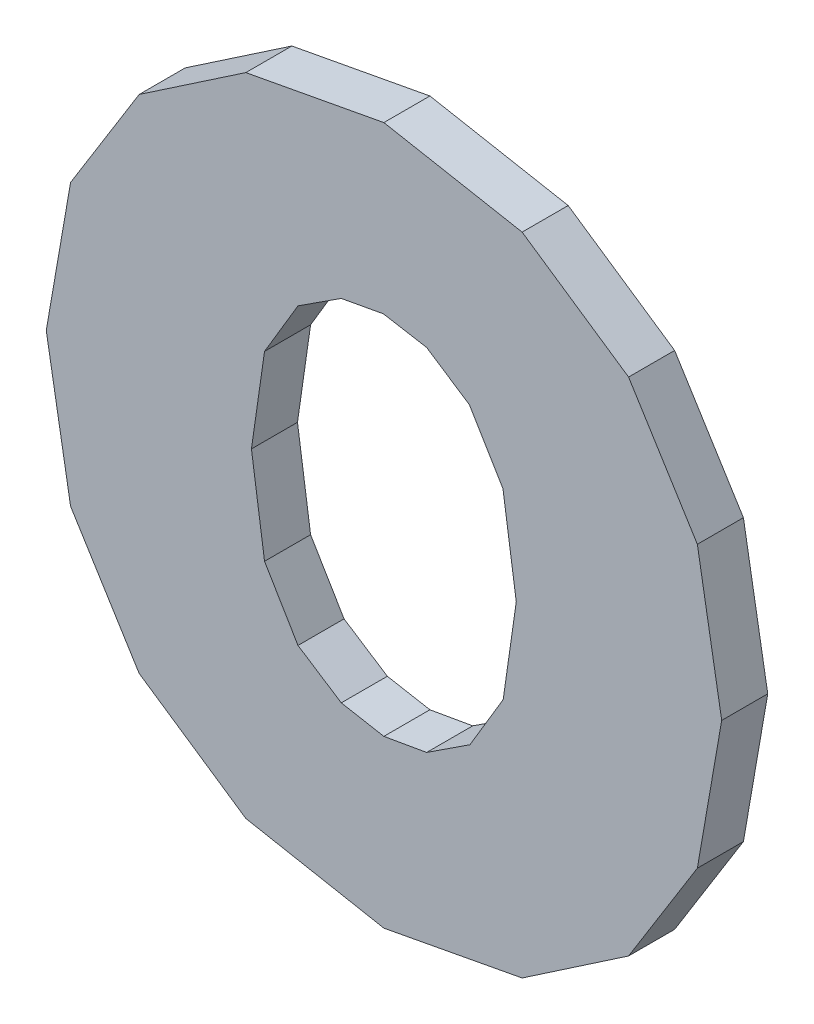
ISO-10303-21;
HEADER;
FILE_DESCRIPTION(('STEP AP214'),'2;1');
FILE_NAME('part.step','',(''),(''),'','','');
FILE_SCHEMA(('AUTOMOTIVE_DESIGN { 1 0 10303 214 1 1 1 1 }'));
ENDSEC;
DATA;
#1=APPLICATION_CONTEXT('core data for automotive mechanical design processes');
#2=APPLICATION_PROTOCOL_DEFINITION('international standard','automotive_design',2000,#1);
#3=PRODUCT_CONTEXT('',#1,'mechanical');
#4=PRODUCT('Part','Part','',(#3));
#5=PRODUCT_RELATED_PRODUCT_CATEGORY('part','',(#4));
#6=PRODUCT_DEFINITION_FORMATION('','',#4);
#7=PRODUCT_DEFINITION_CONTEXT('part definition',#1,'design');
#8=PRODUCT_DEFINITION('design','',#6,#7);
#9=PRODUCT_DEFINITION_SHAPE('','',#8);
#10=(LENGTH_UNIT() NAMED_UNIT(*) SI_UNIT(.MILLI.,.METRE.));
#11=(NAMED_UNIT(*) PLANE_ANGLE_UNIT() SI_UNIT($,.RADIAN.));
#12=(NAMED_UNIT(*) SI_UNIT($,.STERADIAN.) SOLID_ANGLE_UNIT());
#13=UNCERTAINTY_MEASURE_WITH_UNIT(LENGTH_MEASURE(1.E-05),#10,'distance_accuracy_value','');
#14=(GEOMETRIC_REPRESENTATION_CONTEXT(3) GLOBAL_UNCERTAINTY_ASSIGNED_CONTEXT((#13)) GLOBAL_UNIT_ASSIGNED_CONTEXT((#10,
#11,#12)) REPRESENTATION_CONTEXT('',''));
#15=CARTESIAN_POINT('',(0.,0.,0.));
#16=DIRECTION('',(0.,0.,1.));
#17=DIRECTION('',(1.,0.,0.));
#18=AXIS2_PLACEMENT_3D('',#15,#16,#17);
#19=CARTESIAN_POINT('',(0.,0.,0.));
#20=DIRECTION('',(0.,0.,1.));
#21=DIRECTION('',(1.,0.,0.));
#22=AXIS2_PLACEMENT_3D('',#19,#20,#21);
#23=PLANE('',#22);
#24=DIRECTION('',(0.98360655737704,0.180327868852507,0.));
#25=VECTOR('',#24,1.);
#26=CARTESIAN_POINT('',(1.83261,1.206246,0.));
#27=LINE('',#26,#25);
#28=CARTESIAN_POINT('',(1.83261,1.206246,0.));
#29=VERTEX_POINT('',#28);
#30=CARTESIAN_POINT('',(1.87833,1.214628,0.));
#31=VERTEX_POINT('',#30);
#32=EDGE_CURVE('E380',#29,#31,#27,.T.);
#33=ORIENTED_EDGE('',*,*,#32,.F.);
#34=DIRECTION('',(0.838961287027681,0.544191105098988,0.));
#35=VECTOR('',#34,1.);
#36=CARTESIAN_POINT('',(1.78562,1.175766,0.));
#37=LINE('',#36,#35);
#38=CARTESIAN_POINT('',(1.78562,1.175766,0.));
#39=VERTEX_POINT('',#38);
#40=EDGE_CURVE('E375',#39,#29,#37,.T.);
#41=ORIENTED_EDGE('',*,*,#40,.F.);
#42=DIRECTION('',(0.511861383207581,0.859068055732968,0.));
#43=VECTOR('',#42,1.);
#44=CARTESIAN_POINT('',(1.749298,1.114806,0.));
#45=LINE('',#44,#43);
#46=CARTESIAN_POINT('',(1.749298,1.114806,0.));
#47=VERTEX_POINT('',#46);
#48=EDGE_CURVE('E370',#47,#39,#45,.T.);
#49=ORIENTED_EDGE('',*,*,#48,.F.);
#50=DIRECTION('',(0.142489948446306,0.989796249028945,0.));
#51=VECTOR('',#50,1.);
#52=CARTESIAN_POINT('',(1.735074,1.016,0.));
#53=LINE('',#52,#51);
#54=CARTESIAN_POINT('',(1.735074,1.016,0.));
#55=VERTEX_POINT('',#54);
#56=EDGE_CURVE('E365',#55,#47,#53,.T.);
#57=ORIENTED_EDGE('',*,*,#56,.F.);
#58=DIRECTION('',(-0.142849706060598,0.989744391991387,0.));
#59=VECTOR('',#58,1.);
#60=CARTESIAN_POINT('',(1.749298,0.917448,0.));
#61=LINE('',#60,#59);
#62=CARTESIAN_POINT('',(1.749298,0.917448,0.));
#63=VERTEX_POINT('',#62);
#64=EDGE_CURVE('E360',#63,#55,#61,.T.);
#65=ORIENTED_EDGE('',*,*,#64,.F.);
#66=DIRECTION('',(-0.511861383207581,0.859068055732968,0.));
#67=VECTOR('',#66,1.);
#68=CARTESIAN_POINT('',(1.78562,0.856488,0.));
#69=LINE('',#68,#67);
#70=CARTESIAN_POINT('',(1.78562,0.856487999999999,0.));
#71=VERTEX_POINT('',#70);
#72=EDGE_CURVE('E355',#71,#63,#69,.T.);
#73=ORIENTED_EDGE('',*,*,#72,.F.);
#74=DIRECTION('',(-0.838961287027681,0.544191105098988,0.));
#75=VECTOR('',#74,1.);
#76=CARTESIAN_POINT('',(1.83261,0.826008,0.));
#77=LINE('',#76,#75);
#78=CARTESIAN_POINT('',(1.83261,0.826007999999999,0.));
#79=VERTEX_POINT('',#78);
#80=EDGE_CURVE('E350',#79,#71,#77,.T.);
#81=ORIENTED_EDGE('',*,*,#80,.F.);
#82=DIRECTION('',(-0.983956296723587,0.178409658197098,0.));
#83=VECTOR('',#82,1.);
#84=CARTESIAN_POINT('',(1.878838,0.817626,0.));
#85=LINE('',#84,#83);
#86=CARTESIAN_POINT('',(1.878838,0.817626,0.));
#87=VERTEX_POINT('',#86);
#88=EDGE_CURVE('E345',#87,#79,#85,.T.);
#89=ORIENTED_EDGE('',*,*,#88,.F.);
#90=DIRECTION('',(-0.985053308492465,-0.172249758862094,0.));
#91=VECTOR('',#90,1.);
#92=CARTESIAN_POINT('',(1.92532,0.825754,0.));
#93=LINE('',#92,#91);
#94=CARTESIAN_POINT('',(1.92532,0.825754000000001,0.));
#95=VERTEX_POINT('',#94);
#96=EDGE_CURVE('E340',#95,#87,#93,.T.);
#97=ORIENTED_EDGE('',*,*,#96,.F.);
#98=DIRECTION('',(-0.83688991245928,-0.547371240040887,0.));
#99=VECTOR('',#98,1.);
#100=CARTESIAN_POINT('',(1.97231,0.856488,0.));
#101=LINE('',#100,#99);
#102=CARTESIAN_POINT('',(1.97231,0.856488,0.));
#103=VERTEX_POINT('',#102);
#104=EDGE_CURVE('E335',#103,#95,#101,.T.);
#105=ORIENTED_EDGE('',*,*,#104,.F.);
#106=DIRECTION('',(-0.51237167857578,-0.858763799303067,0.));
#107=VECTOR('',#106,1.);
#108=CARTESIAN_POINT('',(2.008378,0.91694,0.));
#109=LINE('',#108,#107);
#110=CARTESIAN_POINT('',(2.008378,0.91694,0.));
#111=VERTEX_POINT('',#110);
#112=EDGE_CURVE('E330',#111,#103,#109,.T.);
#113=ORIENTED_EDGE('',*,*,#112,.F.);
#114=DIRECTION('',(-0.142131979695406,-0.989847715736044,0.));
#115=VECTOR('',#114,1.);
#116=CARTESIAN_POINT('',(2.022602,1.016,0.));
#117=LINE('',#116,#115);
#118=CARTESIAN_POINT('',(2.022602,1.016,0.));
#119=VERTEX_POINT('',#118);
#120=EDGE_CURVE('E325',#119,#111,#117,.T.);
#121=ORIENTED_EDGE('',*,*,#120,.F.);
#122=DIRECTION('',(0.144255265965495,-0.989540508640866,0.));
#123=VECTOR('',#122,1.);
#124=CARTESIAN_POINT('',(2.008124,1.115314,0.));
#125=LINE('',#124,#123);
#126=CARTESIAN_POINT('',(2.008124,1.115314,0.));
#127=VERTEX_POINT('',#126);
#128=EDGE_CURVE('E320',#127,#119,#125,.T.);
#129=ORIENTED_EDGE('',*,*,#128,.F.);
#130=DIRECTION('',(0.515025300745111,-0.857174976065219,0.));
#131=VECTOR('',#130,1.);
#132=CARTESIAN_POINT('',(1.971802,1.175766,0.));
#133=LINE('',#132,#131);
#134=CARTESIAN_POINT('',(1.971802,1.175766,0.));
#135=VERTEX_POINT('',#134);
#136=EDGE_CURVE('E315',#135,#127,#133,.T.);
#137=ORIENTED_EDGE('',*,*,#136,.F.);
#138=DIRECTION('',(0.83414808844179,-0.551540539352193,0.));
#139=VECTOR('',#138,1.);
#140=CARTESIAN_POINT('',(1.92532,1.2065,0.));
#141=LINE('',#140,#139);
#142=CARTESIAN_POINT('',(1.92532,1.2065,0.));
#143=VERTEX_POINT('',#142);
#144=EDGE_CURVE('E391',#143,#135,#141,.T.);
#145=ORIENTED_EDGE('',*,*,#144,.F.);
#146=DIRECTION('',(0.98536771333505,-0.170441982847109,0.));
#147=VECTOR('',#146,1.);
#148=CARTESIAN_POINT('',(1.87833,1.214628,0.));
#149=LINE('',#148,#147);
#150=EDGE_CURVE('E385',#31,#143,#149,.T.);
#151=ORIENTED_EDGE('',*,*,#150,.F.);
#152=EDGE_LOOP('',(#33,#41,#49,#57,#65,#73,#81,#89,#97,#105,#113,#121,#129,#137,#145,#151));
#153=FACE_BOUND('',#152,.T.);
#154=DIRECTION('',(-0.827264523037134,0.561812610150523,0.));
#155=VECTOR('',#154,1.);
#156=CARTESIAN_POINT('',(2.144522,1.288288,0.));
#157=LINE('',#156,#155);
#158=CARTESIAN_POINT('',(2.144522,1.288288,0.));
#159=VERTEX_POINT('',#158);
#160=CARTESIAN_POINT('',(2.028952,1.366774,0.));
#161=VERTEX_POINT('',#160);
#162=EDGE_CURVE('E302',#159,#161,#157,.T.);
#163=ORIENTED_EDGE('',*,*,#162,.F.);
#164=DIRECTION('',(-0.528705152075006,0.84880555027011,0.));
#165=VECTOR('',#164,1.);
#166=CARTESIAN_POINT('',(2.219198,1.1684,0.));
#167=LINE('',#166,#165);
#168=CARTESIAN_POINT('',(2.219198,1.1684,0.));
#169=VERTEX_POINT('',#168);
#170=EDGE_CURVE('E297',#169,#159,#167,.T.);
#171=ORIENTED_EDGE('',*,*,#170,.F.);
#172=DIRECTION('',(-0.170786723535908,0.985308020399646,0.));
#173=VECTOR('',#172,1.);
#174=CARTESIAN_POINT('',(2.245614,1.016,0.));
#175=LINE('',#174,#173);
#176=CARTESIAN_POINT('',(2.245614,1.016,0.));
#177=VERTEX_POINT('',#176);
#178=EDGE_CURVE('E292',#177,#169,#175,.T.);
#179=ORIENTED_EDGE('',*,*,#178,.F.);
#180=DIRECTION('',(0.171063506644398,0.98526000461529,0.));
#181=VECTOR('',#180,1.);
#182=CARTESIAN_POINT('',(2.219198,0.863854,0.));
#183=LINE('',#182,#181);
#184=CARTESIAN_POINT('',(2.219198,0.863854000000001,0.));
#185=VERTEX_POINT('',#184);
#186=EDGE_CURVE('E287',#185,#177,#183,.T.);
#187=ORIENTED_EDGE('',*,*,#186,.F.);
#188=DIRECTION('',(0.528705152075006,0.84880555027011,0.));
#189=VECTOR('',#188,1.);
#190=CARTESIAN_POINT('',(2.144522,0.743966,0.));
#191=LINE('',#190,#189);
#192=CARTESIAN_POINT('',(2.144522,0.743966000000001,0.));
#193=VERTEX_POINT('',#192);
#194=EDGE_CURVE('E282',#193,#185,#191,.T.);
#195=ORIENTED_EDGE('',*,*,#194,.F.);
#196=DIRECTION('',(0.827264523037134,0.561812610150523,0.));
#197=VECTOR('',#196,1.);
#198=CARTESIAN_POINT('',(2.028952,0.66548,0.));
#199=LINE('',#198,#197);
#200=CARTESIAN_POINT('',(2.028952,0.665480000000001,0.));
#201=VERTEX_POINT('',#200);
#202=EDGE_CURVE('E277',#201,#193,#199,.T.);
#203=ORIENTED_EDGE('',*,*,#202,.F.);
#204=DIRECTION('',(0.982815662528847,0.184589743723709,0.));
#205=VECTOR('',#204,1.);
#206=CARTESIAN_POINT('',(1.878838,0.637286,0.));
#207=LINE('',#206,#205);
#208=CARTESIAN_POINT('',(1.878838,0.637285999999999,0.));
#209=VERTEX_POINT('',#208);
#210=EDGE_CURVE('E272',#209,#201,#207,.T.);
#211=ORIENTED_EDGE('',*,*,#210,.F.);
#212=DIRECTION('',(0.982758860293134,-0.184891921173806,0.));
#213=VECTOR('',#212,1.);
#214=CARTESIAN_POINT('',(1.728978,0.66548,0.));
#215=LINE('',#214,#213);
#216=CARTESIAN_POINT('',(1.728978,0.665479999999999,0.));
#217=VERTEX_POINT('',#216);
#218=EDGE_CURVE('E267',#217,#209,#215,.T.);
#219=ORIENTED_EDGE('',*,*,#218,.F.);
#220=DIRECTION('',(0.827837103819016,-0.560968563772111,0.));
#221=VECTOR('',#220,1.);
#222=CARTESIAN_POINT('',(1.613154,0.743966,0.));
#223=LINE('',#222,#221);
#224=CARTESIAN_POINT('',(1.613154,0.743966000000002,0.));
#225=VERTEX_POINT('',#224);
#226=EDGE_CURVE('E262',#225,#217,#223,.T.);
#227=ORIENTED_EDGE('',*,*,#226,.F.);
#228=DIRECTION('',(0.5274076685633,-0.8496123534534,0.));
#229=VECTOR('',#228,1.);
#230=CARTESIAN_POINT('',(1.538732,0.863854,0.));
#231=LINE('',#230,#229);
#232=CARTESIAN_POINT('',(1.538732,0.863854,0.));
#233=VERTEX_POINT('',#232);
#234=EDGE_CURVE('E257',#233,#225,#231,.T.);
#235=ORIENTED_EDGE('',*,*,#234,.F.);
#236=DIRECTION('',(0.171063506644398,-0.98526000461529,0.));
#237=VECTOR('',#236,1.);
#238=CARTESIAN_POINT('',(1.512316,1.016,0.));
#239=LINE('',#238,#237);
#240=CARTESIAN_POINT('',(1.512316,1.016,0.));
#241=VERTEX_POINT('',#240);
#242=EDGE_CURVE('E252',#241,#233,#239,.T.);
#243=ORIENTED_EDGE('',*,*,#242,.F.);
#244=DIRECTION('',(-0.170786723535908,-0.985308020399646,0.));
#245=VECTOR('',#244,1.);
#246=CARTESIAN_POINT('',(1.538732,1.1684,0.));
#247=LINE('',#246,#245);
#248=CARTESIAN_POINT('',(1.538732,1.1684,0.));
#249=VERTEX_POINT('',#248);
#250=EDGE_CURVE('E238',#249,#241,#247,.T.);
#251=ORIENTED_EDGE('',*,*,#250,.F.);
#252=DIRECTION('',(-0.5274076685633,-0.8496123534534,0.));
#253=VECTOR('',#252,1.);
#254=CARTESIAN_POINT('',(1.613154,1.288288,0.));
#255=LINE('',#254,#253);
#256=CARTESIAN_POINT('',(1.613154,1.288288,0.));
#257=VERTEX_POINT('',#256);
#258=EDGE_CURVE('E223',#257,#249,#255,.T.);
#259=ORIENTED_EDGE('',*,*,#258,.F.);
#260=DIRECTION('',(-0.827837103819016,-0.560968563772111,0.));
#261=VECTOR('',#260,1.);
#262=CARTESIAN_POINT('',(1.728978,1.366774,0.));
#263=LINE('',#262,#261);
#264=CARTESIAN_POINT('',(1.728978,1.366774,0.));
#265=VERTEX_POINT('',#264);
#266=EDGE_CURVE('E20',#265,#257,#263,.T.);
#267=ORIENTED_EDGE('',*,*,#266,.F.);
#268=DIRECTION('',(-0.983060298944251,-0.18328242861671,0.));
#269=VECTOR('',#268,1.);
#270=CARTESIAN_POINT('',(1.878838,1.394714,0.));
#271=LINE('',#270,#269);
#272=CARTESIAN_POINT('',(1.878838,1.394714,0.));
#273=VERTEX_POINT('',#272);
#274=EDGE_CURVE('E313',#273,#265,#271,.T.);
#275=ORIENTED_EDGE('',*,*,#274,.F.);
#276=DIRECTION('',(-0.983116133589082,0.182982698299197,0.));
#277=VECTOR('',#276,1.);
#278=CARTESIAN_POINT('',(2.028952,1.366774,0.));
#279=LINE('',#278,#277);
#280=EDGE_CURVE('E307',#161,#273,#279,.T.);
#281=ORIENTED_EDGE('',*,*,#280,.F.);
#282=EDGE_LOOP('',(#163,#171,#179,#187,#195,#203,#211,#219,#227,#235,#243,#251,#259,#267,#275,#281));
#283=FACE_BOUND('',#282,.T.);
#284=ADVANCED_FACE('F17',(#153,#283),#23,.F.);
#285=CARTESIAN_POINT('',(1.728978,1.366774,0.));
#286=DIRECTION('',(-0.560968563772111,0.827837103819016,0.));
#287=DIRECTION('',(-0.827837103819016,-0.560968563772111,0.));
#288=AXIS2_PLACEMENT_3D('',#285,#286,#287);
#289=PLANE('',#288);
#290=DIRECTION('',(0.,0.,1.));
#291=VECTOR('',#290,1.);
#292=CARTESIAN_POINT('',(1.728978,1.366774,0.));
#293=LINE('',#292,#291);
#294=CARTESIAN_POINT('',(1.728978,1.366774,0.05));
#295=VERTEX_POINT('',#294);
#296=EDGE_CURVE('E232',#265,#295,#293,.T.);
#297=ORIENTED_EDGE('',*,*,#296,.F.);
#298=ORIENTED_EDGE('',*,*,#266,.T.);
#299=DIRECTION('',(0.,0.,1.));
#300=VECTOR('',#299,1.);
#301=CARTESIAN_POINT('',(1.613154,1.288288,0.));
#302=LINE('',#301,#300);
#303=CARTESIAN_POINT('',(1.613154,1.288288,0.05));
#304=VERTEX_POINT('',#303);
#305=EDGE_CURVE('E229',#304,#257,#302,.F.);
#306=ORIENTED_EDGE('',*,*,#305,.F.);
#307=DIRECTION('',(-0.827837103819023,-0.5609685637721,0.));
#308=VECTOR('',#307,1.);
#309=CARTESIAN_POINT('',(1.728978,1.366774,0.05));
#310=LINE('',#309,#308);
#311=EDGE_CURVE('E394',#295,#304,#310,.T.);
#312=ORIENTED_EDGE('',*,*,#311,.F.);
#313=EDGE_LOOP('',(#297,#298,#306,#312));
#314=FACE_BOUND('',#313,.T.);
#315=ADVANCED_FACE('F228',(#314),#289,.T.);
#316=CARTESIAN_POINT('',(1.613154,1.288288,0.));
#317=DIRECTION('',(-0.8496123534534,0.5274076685633,0.));
#318=DIRECTION('',(-0.5274076685633,-0.8496123534534,0.));
#319=AXIS2_PLACEMENT_3D('',#316,#317,#318);
#320=PLANE('',#319);
#321=ORIENTED_EDGE('',*,*,#305,.T.);
#322=ORIENTED_EDGE('',*,*,#258,.T.);
#323=DIRECTION('',(0.,0.,1.));
#324=VECTOR('',#323,1.);
#325=CARTESIAN_POINT('',(1.538732,1.1684,0.));
#326=LINE('',#325,#324);
#327=CARTESIAN_POINT('',(1.538732,1.1684,0.05));
#328=VERTEX_POINT('',#327);
#329=EDGE_CURVE('E240',#328,#249,#326,.F.);
#330=ORIENTED_EDGE('',*,*,#329,.F.);
#331=DIRECTION('',(-0.527407668563252,-0.849612353453429,0.));
#332=VECTOR('',#331,1.);
#333=CARTESIAN_POINT('',(1.613154,1.288288,0.05));
#334=LINE('',#333,#332);
#335=EDGE_CURVE('E244',#304,#328,#334,.T.);
#336=ORIENTED_EDGE('',*,*,#335,.F.);
#337=EDGE_LOOP('',(#321,#322,#330,#336));
#338=FACE_BOUND('',#337,.T.);
#339=ADVANCED_FACE('F242',(#338),#320,.T.);
#340=CARTESIAN_POINT('',(1.538732,1.1684,0.));
#341=DIRECTION('',(-0.985308020399646,0.170786723535908,0.));
#342=DIRECTION('',(-0.170786723535908,-0.985308020399646,0.));
#343=AXIS2_PLACEMENT_3D('',#340,#341,#342);
#344=PLANE('',#343);
#345=ORIENTED_EDGE('',*,*,#329,.T.);
#346=ORIENTED_EDGE('',*,*,#250,.T.);
#347=DIRECTION('',(0.,0.,1.));
#348=VECTOR('',#347,1.);
#349=CARTESIAN_POINT('',(1.512316,1.016,0.));
#350=LINE('',#349,#348);
#351=CARTESIAN_POINT('',(1.512316,1.016,0.05));
#352=VERTEX_POINT('',#351);
#353=EDGE_CURVE('E249',#352,#241,#350,.F.);
#354=ORIENTED_EDGE('',*,*,#353,.F.);
#355=DIRECTION('',(-0.170786723535938,-0.985308020399641,0.));
#356=VECTOR('',#355,1.);
#357=CARTESIAN_POINT('',(1.538732,1.1684,0.05));
#358=LINE('',#357,#356);
#359=EDGE_CURVE('E397',#328,#352,#358,.T.);
#360=ORIENTED_EDGE('',*,*,#359,.F.);
#361=EDGE_LOOP('',(#345,#346,#354,#360));
#362=FACE_BOUND('',#361,.T.);
#363=ADVANCED_FACE('F793',(#362),#344,.T.);
#364=CARTESIAN_POINT('',(1.512316,1.016,0.));
#365=DIRECTION('',(-0.98526000461529,-0.171063506644398,0.));
#366=DIRECTION('',(0.171063506644398,-0.98526000461529,0.));
#367=AXIS2_PLACEMENT_3D('',#364,#365,#366);
#368=PLANE('',#367);
#369=ORIENTED_EDGE('',*,*,#353,.T.);
#370=ORIENTED_EDGE('',*,*,#242,.T.);
#371=DIRECTION('',(0.,0.,1.));
#372=VECTOR('',#371,1.);
#373=CARTESIAN_POINT('',(1.538732,0.863854,0.));
#374=LINE('',#373,#372);
#375=CARTESIAN_POINT('',(1.538732,0.863854,0.05));
#376=VERTEX_POINT('',#375);
#377=EDGE_CURVE('E254',#376,#233,#374,.F.);
#378=ORIENTED_EDGE('',*,*,#377,.F.);
#379=DIRECTION('',(0.171063506644391,-0.985260004615292,0.));
#380=VECTOR('',#379,1.);
#381=CARTESIAN_POINT('',(1.512316,1.016,0.05));
#382=LINE('',#381,#380);
#383=EDGE_CURVE('E400',#352,#376,#382,.T.);
#384=ORIENTED_EDGE('',*,*,#383,.F.);
#385=EDGE_LOOP('',(#369,#370,#378,#384));
#386=FACE_BOUND('',#385,.T.);
#387=ADVANCED_FACE('F784',(#386),#368,.T.);
#388=CARTESIAN_POINT('',(1.538732,0.863854,0.));
#389=DIRECTION('',(-0.8496123534534,-0.5274076685633,0.));
#390=DIRECTION('',(0.5274076685633,-0.8496123534534,0.));
#391=AXIS2_PLACEMENT_3D('',#388,#389,#390);
#392=PLANE('',#391);
#393=ORIENTED_EDGE('',*,*,#377,.T.);
#394=ORIENTED_EDGE('',*,*,#234,.T.);
#395=DIRECTION('',(0.,0.,1.));
#396=VECTOR('',#395,1.);
#397=CARTESIAN_POINT('',(1.613154,0.743966,0.));
#398=LINE('',#397,#396);
#399=CARTESIAN_POINT('',(1.613154,0.743966000000002,0.05));
#400=VERTEX_POINT('',#399);
#401=EDGE_CURVE('E259',#400,#225,#398,.F.);
#402=ORIENTED_EDGE('',*,*,#401,.F.);
#403=DIRECTION('',(0.527407668563251,-0.84961235345343,0.));
#404=VECTOR('',#403,1.);
#405=CARTESIAN_POINT('',(1.538732,0.863854,0.05));
#406=LINE('',#405,#404);
#407=EDGE_CURVE('E403',#376,#400,#406,.T.);
#408=ORIENTED_EDGE('',*,*,#407,.F.);
#409=EDGE_LOOP('',(#393,#394,#402,#408));
#410=FACE_BOUND('',#409,.T.);
#411=ADVANCED_FACE('F775',(#410),#392,.T.);
#412=CARTESIAN_POINT('',(1.613154,0.743966,0.));
#413=DIRECTION('',(-0.560968563772111,-0.827837103819016,0.));
#414=DIRECTION('',(0.827837103819016,-0.560968563772111,0.));
#415=AXIS2_PLACEMENT_3D('',#412,#413,#414);
#416=PLANE('',#415);
#417=ORIENTED_EDGE('',*,*,#401,.T.);
#418=ORIENTED_EDGE('',*,*,#226,.T.);
#419=DIRECTION('',(0.,0.,1.));
#420=VECTOR('',#419,1.);
#421=CARTESIAN_POINT('',(1.728978,0.66548,0.));
#422=LINE('',#421,#420);
#423=CARTESIAN_POINT('',(1.728978,0.665479999999999,0.05));
#424=VERTEX_POINT('',#423);
#425=EDGE_CURVE('E264',#424,#217,#422,.F.);
#426=ORIENTED_EDGE('',*,*,#425,.F.);
#427=DIRECTION('',(0.827837103819022,-0.560968563772101,0.));
#428=VECTOR('',#427,1.);
#429=CARTESIAN_POINT('',(1.613154,0.743966,0.05));
#430=LINE('',#429,#428);
#431=EDGE_CURVE('E406',#400,#424,#430,.T.);
#432=ORIENTED_EDGE('',*,*,#431,.F.);
#433=EDGE_LOOP('',(#417,#418,#426,#432));
#434=FACE_BOUND('',#433,.T.);
#435=ADVANCED_FACE('F766',(#434),#416,.T.);
#436=CARTESIAN_POINT('',(1.728978,0.66548,0.));
#437=DIRECTION('',(-0.184891921173806,-0.982758860293134,0.));
#438=DIRECTION('',(0.982758860293134,-0.184891921173806,0.));
#439=AXIS2_PLACEMENT_3D('',#436,#437,#438);
#440=PLANE('',#439);
#441=ORIENTED_EDGE('',*,*,#425,.T.);
#442=ORIENTED_EDGE('',*,*,#218,.T.);
#443=DIRECTION('',(0.,0.,1.));
#444=VECTOR('',#443,1.);
#445=CARTESIAN_POINT('',(1.878838,0.637286,0.));
#446=LINE('',#445,#444);
#447=CARTESIAN_POINT('',(1.878838,0.637285999999999,0.05));
#448=VERTEX_POINT('',#447);
#449=EDGE_CURVE('E269',#448,#209,#446,.F.);
#450=ORIENTED_EDGE('',*,*,#449,.F.);
#451=DIRECTION('',(0.982758860293136,-0.184891921173793,0.));
#452=VECTOR('',#451,1.);
#453=CARTESIAN_POINT('',(1.728978,0.66548,0.05));
#454=LINE('',#453,#452);
#455=EDGE_CURVE('E409',#424,#448,#454,.T.);
#456=ORIENTED_EDGE('',*,*,#455,.F.);
#457=EDGE_LOOP('',(#441,#442,#450,#456));
#458=FACE_BOUND('',#457,.T.);
#459=ADVANCED_FACE('F757',(#458),#440,.T.);
#460=CARTESIAN_POINT('',(1.878838,0.637286,0.));
#461=DIRECTION('',(0.184589743723709,-0.982815662528847,0.));
#462=DIRECTION('',(0.982815662528847,0.184589743723709,0.));
#463=AXIS2_PLACEMENT_3D('',#460,#461,#462);
#464=PLANE('',#463);
#465=ORIENTED_EDGE('',*,*,#449,.T.);
#466=ORIENTED_EDGE('',*,*,#210,.T.);
#467=DIRECTION('',(0.,0.,1.));
#468=VECTOR('',#467,1.);
#469=CARTESIAN_POINT('',(2.028952,0.66548,0.));
#470=LINE('',#469,#468);
#471=CARTESIAN_POINT('',(2.028952,0.665480000000001,0.05));
#472=VERTEX_POINT('',#471);
#473=EDGE_CURVE('E274',#472,#201,#470,.F.);
#474=ORIENTED_EDGE('',*,*,#473,.F.);
#475=DIRECTION('',(0.98281566252885,0.184589743723692,0.));
#476=VECTOR('',#475,1.);
#477=CARTESIAN_POINT('',(1.878838,0.637286,0.05));
#478=LINE('',#477,#476);
#479=EDGE_CURVE('E412',#448,#472,#478,.T.);
#480=ORIENTED_EDGE('',*,*,#479,.F.);
#481=EDGE_LOOP('',(#465,#466,#474,#480));
#482=FACE_BOUND('',#481,.T.);
#483=ADVANCED_FACE('F748',(#482),#464,.T.);
#484=CARTESIAN_POINT('',(2.028952,0.66548,0.));
#485=DIRECTION('',(0.561812610150523,-0.827264523037134,0.));
#486=DIRECTION('',(0.827264523037134,0.561812610150523,0.));
#487=AXIS2_PLACEMENT_3D('',#484,#485,#486);
#488=PLANE('',#487);
#489=ORIENTED_EDGE('',*,*,#473,.T.);
#490=ORIENTED_EDGE('',*,*,#202,.T.);
#491=DIRECTION('',(0.,0.,1.));
#492=VECTOR('',#491,1.);
#493=CARTESIAN_POINT('',(2.144522,0.743966,0.));
#494=LINE('',#493,#492);
#495=CARTESIAN_POINT('',(2.144522,0.743966000000001,0.05));
#496=VERTEX_POINT('',#495);
#497=EDGE_CURVE('E279',#496,#193,#494,.F.);
#498=ORIENTED_EDGE('',*,*,#497,.F.);
#499=DIRECTION('',(0.827264523037147,0.561812610150503,0.));
#500=VECTOR('',#499,1.);
#501=CARTESIAN_POINT('',(2.028952,0.66548,0.05));
#502=LINE('',#501,#500);
#503=EDGE_CURVE('E415',#472,#496,#502,.T.);
#504=ORIENTED_EDGE('',*,*,#503,.F.);
#505=EDGE_LOOP('',(#489,#490,#498,#504));
#506=FACE_BOUND('',#505,.T.);
#507=ADVANCED_FACE('F739',(#506),#488,.T.);
#508=CARTESIAN_POINT('',(2.144522,0.743966,0.));
#509=DIRECTION('',(0.84880555027011,-0.528705152075006,0.));
#510=DIRECTION('',(0.528705152075006,0.84880555027011,0.));
#511=AXIS2_PLACEMENT_3D('',#508,#509,#510);
#512=PLANE('',#511);
#513=ORIENTED_EDGE('',*,*,#497,.T.);
#514=ORIENTED_EDGE('',*,*,#194,.T.);
#515=DIRECTION('',(0.,0.,1.));
#516=VECTOR('',#515,1.);
#517=CARTESIAN_POINT('',(2.219198,0.863854,0.));
#518=LINE('',#517,#516);
#519=CARTESIAN_POINT('',(2.219198,0.863854000000001,0.05));
#520=VERTEX_POINT('',#519);
#521=EDGE_CURVE('E284',#520,#185,#518,.F.);
#522=ORIENTED_EDGE('',*,*,#521,.F.);
#523=DIRECTION('',(0.528705152075021,0.848805550270101,0.));
#524=VECTOR('',#523,1.);
#525=CARTESIAN_POINT('',(2.144522,0.743966,0.05));
#526=LINE('',#525,#524);
#527=EDGE_CURVE('E418',#496,#520,#526,.T.);
#528=ORIENTED_EDGE('',*,*,#527,.F.);
#529=EDGE_LOOP('',(#513,#514,#522,#528));
#530=FACE_BOUND('',#529,.T.);
#531=ADVANCED_FACE('F730',(#530),#512,.T.);
#532=CARTESIAN_POINT('',(2.219198,0.863854,0.));
#533=DIRECTION('',(0.98526000461529,-0.171063506644398,0.));
#534=DIRECTION('',(0.171063506644398,0.98526000461529,0.));
#535=AXIS2_PLACEMENT_3D('',#532,#533,#534);
#536=PLANE('',#535);
#537=ORIENTED_EDGE('',*,*,#521,.T.);
#538=ORIENTED_EDGE('',*,*,#186,.T.);
#539=DIRECTION('',(0.,0.,1.));
#540=VECTOR('',#539,1.);
#541=CARTESIAN_POINT('',(2.245614,1.016,0.));
#542=LINE('',#541,#540);
#543=CARTESIAN_POINT('',(2.245614,1.016,0.05));
#544=VERTEX_POINT('',#543);
#545=EDGE_CURVE('E289',#544,#177,#542,.F.);
#546=ORIENTED_EDGE('',*,*,#545,.F.);
#547=DIRECTION('',(0.171063506644394,0.985260004615291,0.));
#548=VECTOR('',#547,1.);
#549=CARTESIAN_POINT('',(2.219198,0.863854,0.05));
#550=LINE('',#549,#548);
#551=EDGE_CURVE('E421',#520,#544,#550,.T.);
#552=ORIENTED_EDGE('',*,*,#551,.F.);
#553=EDGE_LOOP('',(#537,#538,#546,#552));
#554=FACE_BOUND('',#553,.T.);
#555=ADVANCED_FACE('F721',(#554),#536,.T.);
#556=CARTESIAN_POINT('',(2.245614,1.016,0.));
#557=DIRECTION('',(0.985308020399646,0.170786723535908,0.));
#558=DIRECTION('',(-0.170786723535908,0.985308020399646,0.));
#559=AXIS2_PLACEMENT_3D('',#556,#557,#558);
#560=PLANE('',#559);
#561=ORIENTED_EDGE('',*,*,#545,.T.);
#562=ORIENTED_EDGE('',*,*,#178,.T.);
#563=DIRECTION('',(0.,0.,1.));
#564=VECTOR('',#563,1.);
#565=CARTESIAN_POINT('',(2.219198,1.1684,0.));
#566=LINE('',#565,#564);
#567=CARTESIAN_POINT('',(2.219198,1.1684,0.05));
#568=VERTEX_POINT('',#567);
#569=EDGE_CURVE('E294',#568,#169,#566,.F.);
#570=ORIENTED_EDGE('',*,*,#569,.F.);
#571=DIRECTION('',(-0.17078672353594,0.98530802039964,0.));
#572=VECTOR('',#571,1.);
#573=CARTESIAN_POINT('',(2.245614,1.016,0.05));
#574=LINE('',#573,#572);
#575=EDGE_CURVE('E424',#544,#568,#574,.T.);
#576=ORIENTED_EDGE('',*,*,#575,.F.);
#577=EDGE_LOOP('',(#561,#562,#570,#576));
#578=FACE_BOUND('',#577,.T.);
#579=ADVANCED_FACE('F712',(#578),#560,.T.);
#580=CARTESIAN_POINT('',(2.219198,1.1684,0.));
#581=DIRECTION('',(0.84880555027011,0.528705152075006,0.));
#582=DIRECTION('',(-0.528705152075006,0.84880555027011,0.));
#583=AXIS2_PLACEMENT_3D('',#580,#581,#582);
#584=PLANE('',#583);
#585=ORIENTED_EDGE('',*,*,#569,.T.);
#586=ORIENTED_EDGE('',*,*,#170,.T.);
#587=DIRECTION('',(0.,0.,1.));
#588=VECTOR('',#587,1.);
#589=CARTESIAN_POINT('',(2.144522,1.288288,0.));
#590=LINE('',#589,#588);
#591=CARTESIAN_POINT('',(2.144522,1.288288,0.05));
#592=VERTEX_POINT('',#591);
#593=EDGE_CURVE('E299',#592,#159,#590,.F.);
#594=ORIENTED_EDGE('',*,*,#593,.F.);
#595=DIRECTION('',(-0.528705152075021,0.848805550270101,0.));
#596=VECTOR('',#595,1.);
#597=CARTESIAN_POINT('',(2.219198,1.1684,0.05));
#598=LINE('',#597,#596);
#599=EDGE_CURVE('E427',#568,#592,#598,.T.);
#600=ORIENTED_EDGE('',*,*,#599,.F.);
#601=EDGE_LOOP('',(#585,#586,#594,#600));
#602=FACE_BOUND('',#601,.T.);
#603=ADVANCED_FACE('F703',(#602),#584,.T.);
#604=CARTESIAN_POINT('',(2.144522,1.288288,0.));
#605=DIRECTION('',(0.561812610150523,0.827264523037134,0.));
#606=DIRECTION('',(-0.827264523037134,0.561812610150523,0.));
#607=AXIS2_PLACEMENT_3D('',#604,#605,#606);
#608=PLANE('',#607);
#609=ORIENTED_EDGE('',*,*,#593,.T.);
#610=ORIENTED_EDGE('',*,*,#162,.T.);
#611=DIRECTION('',(0.,0.,1.));
#612=VECTOR('',#611,1.);
#613=CARTESIAN_POINT('',(2.028952,1.366774,0.));
#614=LINE('',#613,#612);
#615=CARTESIAN_POINT('',(2.028952,1.366774,0.05));
#616=VERTEX_POINT('',#615);
#617=EDGE_CURVE('E304',#616,#161,#614,.F.);
#618=ORIENTED_EDGE('',*,*,#617,.F.);
#619=DIRECTION('',(-0.827264523037148,0.561812610150502,0.));
#620=VECTOR('',#619,1.);
#621=CARTESIAN_POINT('',(2.144522,1.288288,0.05));
#622=LINE('',#621,#620);
#623=EDGE_CURVE('E430',#592,#616,#622,.T.);
#624=ORIENTED_EDGE('',*,*,#623,.F.);
#625=EDGE_LOOP('',(#609,#610,#618,#624));
#626=FACE_BOUND('',#625,.T.);
#627=ADVANCED_FACE('F694',(#626),#608,.T.);
#628=CARTESIAN_POINT('',(2.028952,1.366774,0.));
#629=DIRECTION('',(0.182982698299197,0.983116133589082,0.));
#630=DIRECTION('',(-0.983116133589082,0.182982698299197,0.));
#631=AXIS2_PLACEMENT_3D('',#628,#629,#630);
#632=PLANE('',#631);
#633=ORIENTED_EDGE('',*,*,#617,.T.);
#634=ORIENTED_EDGE('',*,*,#280,.T.);
#635=DIRECTION('',(0.,0.,1.));
#636=VECTOR('',#635,1.);
#637=CARTESIAN_POINT('',(1.878838,1.394714,0.));
#638=LINE('',#637,#636);
#639=CARTESIAN_POINT('',(1.878838,1.394714,0.05));
#640=VERTEX_POINT('',#639);
#641=EDGE_CURVE('E310',#640,#273,#638,.F.);
#642=ORIENTED_EDGE('',*,*,#641,.F.);
#643=DIRECTION('',(-0.98311613358909,0.182982698299155,0.));
#644=VECTOR('',#643,1.);
#645=CARTESIAN_POINT('',(2.028952,1.366774,0.05));
#646=LINE('',#645,#644);
#647=EDGE_CURVE('E433',#616,#640,#646,.T.);
#648=ORIENTED_EDGE('',*,*,#647,.F.);
#649=EDGE_LOOP('',(#633,#634,#642,#648));
#650=FACE_BOUND('',#649,.T.);
#651=ADVANCED_FACE('F685',(#650),#632,.T.);
#652=CARTESIAN_POINT('',(1.878838,1.394714,0.));
#653=DIRECTION('',(-0.18328242861671,0.983060298944251,0.));
#654=DIRECTION('',(-0.983060298944251,-0.18328242861671,0.));
#655=AXIS2_PLACEMENT_3D('',#652,#653,#654);
#656=PLANE('',#655);
#657=ORIENTED_EDGE('',*,*,#641,.T.);
#658=ORIENTED_EDGE('',*,*,#274,.T.);
#659=ORIENTED_EDGE('',*,*,#296,.T.);
#660=DIRECTION('',(-0.983060298944248,-0.183282428616725,0.));
#661=VECTOR('',#660,1.);
#662=CARTESIAN_POINT('',(1.878838,1.394714,0.05));
#663=LINE('',#662,#661);
#664=EDGE_CURVE('E436',#640,#295,#663,.T.);
#665=ORIENTED_EDGE('',*,*,#664,.F.);
#666=EDGE_LOOP('',(#657,#658,#659,#665));
#667=FACE_BOUND('',#666,.T.);
#668=ADVANCED_FACE('F677',(#667),#656,.T.);
#669=CARTESIAN_POINT('',(1.971802,1.175766,0.));
#670=DIRECTION('',(-0.857174976065219,-0.515025300745111,0.));
#671=DIRECTION('',(0.515025300745111,-0.857174976065219,0.));
#672=AXIS2_PLACEMENT_3D('',#669,#670,#671);
#673=PLANE('',#672);
#674=DIRECTION('',(0.,0.,1.));
#675=VECTOR('',#674,1.);
#676=CARTESIAN_POINT('',(1.971802,1.175766,0.));
#677=LINE('',#676,#675);
#678=CARTESIAN_POINT('',(1.971802,1.175766,0.05));
#679=VERTEX_POINT('',#678);
#680=EDGE_CURVE('E387',#135,#679,#677,.T.);
#681=ORIENTED_EDGE('',*,*,#680,.F.);
#682=ORIENTED_EDGE('',*,*,#136,.T.);
#683=DIRECTION('',(0.,0.,1.));
#684=VECTOR('',#683,1.);
#685=CARTESIAN_POINT('',(2.008124,1.115314,0.));
#686=LINE('',#685,#684);
#687=CARTESIAN_POINT('',(2.008124,1.115314,0.05));
#688=VERTEX_POINT('',#687);
#689=EDGE_CURVE('E317',#688,#127,#686,.F.);
#690=ORIENTED_EDGE('',*,*,#689,.F.);
#691=DIRECTION('',(0.515025300745078,-0.857174976065238,0.));
#692=VECTOR('',#691,1.);
#693=CARTESIAN_POINT('',(1.971802,1.175766,0.05));
#694=LINE('',#693,#692);
#695=EDGE_CURVE('E439',#679,#688,#694,.T.);
#696=ORIENTED_EDGE('',*,*,#695,.F.);
#697=EDGE_LOOP('',(#681,#682,#690,#696));
#698=FACE_BOUND('',#697,.T.);
#699=ADVANCED_FACE('F499',(#698),#673,.T.);
#700=CARTESIAN_POINT('',(2.008124,1.115314,0.));
#701=DIRECTION('',(-0.989540508640866,-0.144255265965495,0.));
#702=DIRECTION('',(0.144255265965495,-0.989540508640866,0.));
#703=AXIS2_PLACEMENT_3D('',#700,#701,#702);
#704=PLANE('',#703);
#705=ORIENTED_EDGE('',*,*,#689,.T.);
#706=ORIENTED_EDGE('',*,*,#128,.T.);
#707=DIRECTION('',(0.,0.,1.));
#708=VECTOR('',#707,1.);
#709=CARTESIAN_POINT('',(2.022602,1.016,0.));
#710=LINE('',#709,#708);
#711=CARTESIAN_POINT('',(2.022602,1.016,0.05));
#712=VERTEX_POINT('',#711);
#713=EDGE_CURVE('E322',#712,#119,#710,.F.);
#714=ORIENTED_EDGE('',*,*,#713,.F.);
#715=DIRECTION('',(0.144255265965548,-0.989540508640859,0.));
#716=VECTOR('',#715,1.);
#717=CARTESIAN_POINT('',(2.008124,1.115314,0.05));
#718=LINE('',#717,#716);
#719=EDGE_CURVE('E442',#688,#712,#718,.T.);
#720=ORIENTED_EDGE('',*,*,#719,.F.);
#721=EDGE_LOOP('',(#705,#706,#714,#720));
#722=FACE_BOUND('',#721,.T.);
#723=ADVANCED_FACE('F503',(#722),#704,.T.);
#724=CARTESIAN_POINT('',(2.022602,1.016,0.));
#725=DIRECTION('',(-0.989847715736044,0.142131979695406,0.));
#726=DIRECTION('',(-0.142131979695406,-0.989847715736044,0.));
#727=AXIS2_PLACEMENT_3D('',#724,#725,#726);
#728=PLANE('',#727);
#729=ORIENTED_EDGE('',*,*,#713,.T.);
#730=ORIENTED_EDGE('',*,*,#120,.T.);
#731=DIRECTION('',(0.,0.,1.));
#732=VECTOR('',#731,1.);
#733=CARTESIAN_POINT('',(2.008378,0.91694,0.));
#734=LINE('',#733,#732);
#735=CARTESIAN_POINT('',(2.008378,0.91694,0.05));
#736=VERTEX_POINT('',#735);
#737=EDGE_CURVE('E327',#736,#111,#734,.F.);
#738=ORIENTED_EDGE('',*,*,#737,.F.);
#739=DIRECTION('',(-0.142131979695433,-0.98984771573604,0.));
#740=VECTOR('',#739,1.);
#741=CARTESIAN_POINT('',(2.022602,1.016,0.05));
#742=LINE('',#741,#740);
#743=EDGE_CURVE('E445',#712,#736,#742,.T.);
#744=ORIENTED_EDGE('',*,*,#743,.F.);
#745=EDGE_LOOP('',(#729,#730,#738,#744));
#746=FACE_BOUND('',#745,.T.);
#747=ADVANCED_FACE('F506',(#746),#728,.T.);
#748=CARTESIAN_POINT('',(2.008378,0.91694,0.));
#749=DIRECTION('',(-0.858763799303067,0.51237167857578,0.));
#750=DIRECTION('',(-0.51237167857578,-0.858763799303067,0.));
#751=AXIS2_PLACEMENT_3D('',#748,#749,#750);
#752=PLANE('',#751);
#753=ORIENTED_EDGE('',*,*,#737,.T.);
#754=ORIENTED_EDGE('',*,*,#112,.T.);
#755=DIRECTION('',(0.,0.,1.));
#756=VECTOR('',#755,1.);
#757=CARTESIAN_POINT('',(1.97231,0.856488,0.));
#758=LINE('',#757,#756);
#759=CARTESIAN_POINT('',(1.97231,0.856488,0.05));
#760=VERTEX_POINT('',#759);
#761=EDGE_CURVE('E332',#760,#103,#758,.F.);
#762=ORIENTED_EDGE('',*,*,#761,.F.);
#763=DIRECTION('',(-0.512371678575778,-0.858763799303068,0.));
#764=VECTOR('',#763,1.);
#765=CARTESIAN_POINT('',(2.008378,0.91694,0.05));
#766=LINE('',#765,#764);
#767=EDGE_CURVE('E448',#736,#760,#766,.T.);
#768=ORIENTED_EDGE('',*,*,#767,.F.);
#769=EDGE_LOOP('',(#753,#754,#762,#768));
#770=FACE_BOUND('',#769,.T.);
#771=ADVANCED_FACE('F510',(#770),#752,.T.);
#772=CARTESIAN_POINT('',(1.97231,0.856488,0.));
#773=DIRECTION('',(-0.547371240040887,0.83688991245928,0.));
#774=DIRECTION('',(-0.83688991245928,-0.547371240040887,0.));
#775=AXIS2_PLACEMENT_3D('',#772,#773,#774);
#776=PLANE('',#775);
#777=ORIENTED_EDGE('',*,*,#761,.T.);
#778=ORIENTED_EDGE('',*,*,#104,.T.);
#779=DIRECTION('',(0.,0.,1.));
#780=VECTOR('',#779,1.);
#781=CARTESIAN_POINT('',(1.92532,0.825754,0.));
#782=LINE('',#781,#780);
#783=CARTESIAN_POINT('',(1.92532,0.825754000000001,0.05));
#784=VERTEX_POINT('',#783);
#785=EDGE_CURVE('E337',#784,#95,#782,.F.);
#786=ORIENTED_EDGE('',*,*,#785,.F.);
#787=DIRECTION('',(-0.836889912459259,-0.547371240040919,0.));
#788=VECTOR('',#787,1.);
#789=CARTESIAN_POINT('',(1.97231,0.856488,0.05));
#790=LINE('',#789,#788);
#791=EDGE_CURVE('E451',#760,#784,#790,.T.);
#792=ORIENTED_EDGE('',*,*,#791,.F.);
#793=EDGE_LOOP('',(#777,#778,#786,#792));
#794=FACE_BOUND('',#793,.T.);
#795=ADVANCED_FACE('F514',(#794),#776,.T.);
#796=CARTESIAN_POINT('',(1.92532,0.825754,0.));
#797=DIRECTION('',(-0.172249758862094,0.985053308492465,0.));
#798=DIRECTION('',(-0.985053308492465,-0.172249758862094,0.));
#799=AXIS2_PLACEMENT_3D('',#796,#797,#798);
#800=PLANE('',#799);
#801=ORIENTED_EDGE('',*,*,#785,.T.);
#802=ORIENTED_EDGE('',*,*,#96,.T.);
#803=DIRECTION('',(0.,0.,1.));
#804=VECTOR('',#803,1.);
#805=CARTESIAN_POINT('',(1.878838,0.817626,0.));
#806=LINE('',#805,#804);
#807=CARTESIAN_POINT('',(1.878838,0.817626,0.05));
#808=VERTEX_POINT('',#807);
#809=EDGE_CURVE('E342',#808,#87,#806,.F.);
#810=ORIENTED_EDGE('',*,*,#809,.F.);
#811=DIRECTION('',(-0.985053308492468,-0.172249758862072,0.));
#812=VECTOR('',#811,1.);
#813=CARTESIAN_POINT('',(1.92532,0.825754,0.05));
#814=LINE('',#813,#812);
#815=EDGE_CURVE('E454',#784,#808,#814,.T.);
#816=ORIENTED_EDGE('',*,*,#815,.F.);
#817=EDGE_LOOP('',(#801,#802,#810,#816));
#818=FACE_BOUND('',#817,.T.);
#819=ADVANCED_FACE('F518',(#818),#800,.T.);
#820=CARTESIAN_POINT('',(1.878838,0.817626,0.));
#821=DIRECTION('',(0.178409658197098,0.983956296723587,0.));
#822=DIRECTION('',(-0.983956296723587,0.178409658197098,0.));
#823=AXIS2_PLACEMENT_3D('',#820,#821,#822);
#824=PLANE('',#823);
#825=ORIENTED_EDGE('',*,*,#809,.T.);
#826=ORIENTED_EDGE('',*,*,#88,.T.);
#827=DIRECTION('',(0.,0.,1.));
#828=VECTOR('',#827,1.);
#829=CARTESIAN_POINT('',(1.83261,0.826008,0.));
#830=LINE('',#829,#828);
#831=CARTESIAN_POINT('',(1.83261,0.826007999999999,0.05));
#832=VERTEX_POINT('',#831);
#833=EDGE_CURVE('E347',#832,#79,#830,.F.);
#834=ORIENTED_EDGE('',*,*,#833,.F.);
#835=DIRECTION('',(-0.98395629672358,0.178409658197131,0.));
#836=VECTOR('',#835,1.);
#837=CARTESIAN_POINT('',(1.878838,0.817626,0.05));
#838=LINE('',#837,#836);
#839=EDGE_CURVE('E457',#808,#832,#838,.T.);
#840=ORIENTED_EDGE('',*,*,#839,.F.);
#841=EDGE_LOOP('',(#825,#826,#834,#840));
#842=FACE_BOUND('',#841,.T.);
#843=ADVANCED_FACE('F522',(#842),#824,.T.);
#844=CARTESIAN_POINT('',(1.83261,0.826008,0.));
#845=DIRECTION('',(0.544191105098988,0.838961287027681,0.));
#846=DIRECTION('',(-0.838961287027681,0.544191105098988,0.));
#847=AXIS2_PLACEMENT_3D('',#844,#845,#846);
#848=PLANE('',#847);
#849=ORIENTED_EDGE('',*,*,#833,.T.);
#850=ORIENTED_EDGE('',*,*,#80,.T.);
#851=DIRECTION('',(0.,0.,1.));
#852=VECTOR('',#851,1.);
#853=CARTESIAN_POINT('',(1.78562,0.856488,0.));
#854=LINE('',#853,#852);
#855=CARTESIAN_POINT('',(1.78562,0.856487999999999,0.05));
#856=VERTEX_POINT('',#855);
#857=EDGE_CURVE('E352',#856,#71,#854,.F.);
#858=ORIENTED_EDGE('',*,*,#857,.F.);
#859=DIRECTION('',(-0.838961287027658,0.544191105099022,0.));
#860=VECTOR('',#859,1.);
#861=CARTESIAN_POINT('',(1.83261,0.826008,0.05));
#862=LINE('',#861,#860);
#863=EDGE_CURVE('E460',#832,#856,#862,.T.);
#864=ORIENTED_EDGE('',*,*,#863,.F.);
#865=EDGE_LOOP('',(#849,#850,#858,#864));
#866=FACE_BOUND('',#865,.T.);
#867=ADVANCED_FACE('F526',(#866),#848,.T.);
#868=CARTESIAN_POINT('',(1.78562,0.856488,0.));
#869=DIRECTION('',(0.859068055732968,0.511861383207581,0.));
#870=DIRECTION('',(-0.511861383207581,0.859068055732968,0.));
#871=AXIS2_PLACEMENT_3D('',#868,#869,#870);
#872=PLANE('',#871);
#873=ORIENTED_EDGE('',*,*,#857,.T.);
#874=ORIENTED_EDGE('',*,*,#72,.T.);
#875=DIRECTION('',(0.,0.,1.));
#876=VECTOR('',#875,1.);
#877=CARTESIAN_POINT('',(1.749298,0.917448,0.));
#878=LINE('',#877,#876);
#879=CARTESIAN_POINT('',(1.749298,0.917448,0.05));
#880=VERTEX_POINT('',#879);
#881=EDGE_CURVE('E357',#880,#63,#878,.F.);
#882=ORIENTED_EDGE('',*,*,#881,.F.);
#883=DIRECTION('',(-0.511861383207564,0.859068055732978,0.));
#884=VECTOR('',#883,1.);
#885=CARTESIAN_POINT('',(1.78562,0.856488,0.05));
#886=LINE('',#885,#884);
#887=EDGE_CURVE('E463',#856,#880,#886,.T.);
#888=ORIENTED_EDGE('',*,*,#887,.F.);
#889=EDGE_LOOP('',(#873,#874,#882,#888));
#890=FACE_BOUND('',#889,.T.);
#891=ADVANCED_FACE('F530',(#890),#872,.T.);
#892=CARTESIAN_POINT('',(1.749298,0.917448,0.));
#893=DIRECTION('',(0.989744391991387,0.142849706060598,0.));
#894=DIRECTION('',(-0.142849706060598,0.989744391991387,0.));
#895=AXIS2_PLACEMENT_3D('',#892,#893,#894);
#896=PLANE('',#895);
#897=ORIENTED_EDGE('',*,*,#881,.T.);
#898=ORIENTED_EDGE('',*,*,#64,.T.);
#899=DIRECTION('',(0.,0.,1.));
#900=VECTOR('',#899,1.);
#901=CARTESIAN_POINT('',(1.735074,1.016,0.));
#902=LINE('',#901,#900);
#903=CARTESIAN_POINT('',(1.735074,1.016,0.05));
#904=VERTEX_POINT('',#903);
#905=EDGE_CURVE('E362',#904,#55,#902,.F.);
#906=ORIENTED_EDGE('',*,*,#905,.F.);
#907=DIRECTION('',(-0.142849706060612,0.989744391991385,0.));
#908=VECTOR('',#907,1.);
#909=CARTESIAN_POINT('',(1.749298,0.917448,0.05));
#910=LINE('',#909,#908);
#911=EDGE_CURVE('E466',#880,#904,#910,.T.);
#912=ORIENTED_EDGE('',*,*,#911,.F.);
#913=EDGE_LOOP('',(#897,#898,#906,#912));
#914=FACE_BOUND('',#913,.T.);
#915=ADVANCED_FACE('F534',(#914),#896,.T.);
#916=CARTESIAN_POINT('',(1.735074,1.016,0.));
#917=DIRECTION('',(0.989796249028945,-0.142489948446306,0.));
#918=DIRECTION('',(0.142489948446306,0.989796249028945,0.));
#919=AXIS2_PLACEMENT_3D('',#916,#917,#918);
#920=PLANE('',#919);
#921=ORIENTED_EDGE('',*,*,#905,.T.);
#922=ORIENTED_EDGE('',*,*,#56,.T.);
#923=DIRECTION('',(0.,0.,1.));
#924=VECTOR('',#923,1.);
#925=CARTESIAN_POINT('',(1.749298,1.114806,0.));
#926=LINE('',#925,#924);
#927=CARTESIAN_POINT('',(1.749298,1.114806,0.05));
#928=VERTEX_POINT('',#927);
#929=EDGE_CURVE('E367',#928,#47,#926,.F.);
#930=ORIENTED_EDGE('',*,*,#929,.F.);
#931=DIRECTION('',(0.142489948446325,0.989796249028942,0.));
#932=VECTOR('',#931,1.);
#933=CARTESIAN_POINT('',(1.735074,1.016,0.05));
#934=LINE('',#933,#932);
#935=EDGE_CURVE('E469',#904,#928,#934,.T.);
#936=ORIENTED_EDGE('',*,*,#935,.F.);
#937=EDGE_LOOP('',(#921,#922,#930,#936));
#938=FACE_BOUND('',#937,.T.);
#939=ADVANCED_FACE('F538',(#938),#920,.T.);
#940=CARTESIAN_POINT('',(1.749298,1.114806,0.));
#941=DIRECTION('',(0.859068055732968,-0.511861383207581,0.));
#942=DIRECTION('',(0.511861383207581,0.859068055732968,0.));
#943=AXIS2_PLACEMENT_3D('',#940,#941,#942);
#944=PLANE('',#943);
#945=ORIENTED_EDGE('',*,*,#929,.T.);
#946=ORIENTED_EDGE('',*,*,#48,.T.);
#947=DIRECTION('',(0.,0.,1.));
#948=VECTOR('',#947,1.);
#949=CARTESIAN_POINT('',(1.78562,1.175766,0.));
#950=LINE('',#949,#948);
#951=CARTESIAN_POINT('',(1.78562,1.175766,0.05));
#952=VERTEX_POINT('',#951);
#953=EDGE_CURVE('E372',#952,#39,#950,.F.);
#954=ORIENTED_EDGE('',*,*,#953,.F.);
#955=DIRECTION('',(0.511861383207564,0.859068055732978,0.));
#956=VECTOR('',#955,1.);
#957=CARTESIAN_POINT('',(1.749298,1.114806,0.05));
#958=LINE('',#957,#956);
#959=EDGE_CURVE('E472',#928,#952,#958,.T.);
#960=ORIENTED_EDGE('',*,*,#959,.F.);
#961=EDGE_LOOP('',(#945,#946,#954,#960));
#962=FACE_BOUND('',#961,.T.);
#963=ADVANCED_FACE('F542',(#962),#944,.T.);
#964=CARTESIAN_POINT('',(1.78562,1.175766,0.));
#965=DIRECTION('',(0.544191105098988,-0.838961287027681,0.));
#966=DIRECTION('',(0.838961287027681,0.544191105098988,0.));
#967=AXIS2_PLACEMENT_3D('',#964,#965,#966);
#968=PLANE('',#967);
#969=ORIENTED_EDGE('',*,*,#953,.T.);
#970=ORIENTED_EDGE('',*,*,#40,.T.);
#971=DIRECTION('',(0.,0.,1.));
#972=VECTOR('',#971,1.);
#973=CARTESIAN_POINT('',(1.83261,1.206246,0.));
#974=LINE('',#973,#972);
#975=CARTESIAN_POINT('',(1.83261,1.206246,0.05));
#976=VERTEX_POINT('',#975);
#977=EDGE_CURVE('E377',#976,#29,#974,.F.);
#978=ORIENTED_EDGE('',*,*,#977,.F.);
#979=DIRECTION('',(0.838961287027661,0.544191105099018,0.));
#980=VECTOR('',#979,1.);
#981=CARTESIAN_POINT('',(1.78562,1.175766,0.05));
#982=LINE('',#981,#980);
#983=EDGE_CURVE('E475',#952,#976,#982,.T.);
#984=ORIENTED_EDGE('',*,*,#983,.F.);
#985=EDGE_LOOP('',(#969,#970,#978,#984));
#986=FACE_BOUND('',#985,.T.);
#987=ADVANCED_FACE('F545',(#986),#968,.T.);
#988=CARTESIAN_POINT('',(1.83261,1.206246,0.));
#989=DIRECTION('',(0.180327868852507,-0.98360655737704,0.));
#990=DIRECTION('',(0.98360655737704,0.180327868852507,0.));
#991=AXIS2_PLACEMENT_3D('',#988,#989,#990);
#992=PLANE('',#991);
#993=ORIENTED_EDGE('',*,*,#977,.T.);
#994=ORIENTED_EDGE('',*,*,#32,.T.);
#995=DIRECTION('',(0.,0.,1.));
#996=VECTOR('',#995,1.);
#997=CARTESIAN_POINT('',(1.87833,1.214628,0.));
#998=LINE('',#997,#996);
#999=CARTESIAN_POINT('',(1.87833,1.214628,0.05));
#1000=VERTEX_POINT('',#999);
#1001=EDGE_CURVE('E382',#1000,#31,#998,.F.);
#1002=ORIENTED_EDGE('',*,*,#1001,.F.);
#1003=DIRECTION('',(0.983606557377049,0.180327868852462,0.));
#1004=VECTOR('',#1003,1.);
#1005=CARTESIAN_POINT('',(1.83261,1.206246,0.05));
#1006=LINE('',#1005,#1004);
#1007=EDGE_CURVE('E478',#976,#1000,#1006,.T.);
#1008=ORIENTED_EDGE('',*,*,#1007,.F.);
#1009=EDGE_LOOP('',(#993,#994,#1002,#1008));
#1010=FACE_BOUND('',#1009,.T.);
#1011=ADVANCED_FACE('F490',(#1010),#992,.T.);
#1012=CARTESIAN_POINT('',(1.87833,1.214628,0.));
#1013=DIRECTION('',(-0.170441982847109,-0.98536771333505,0.));
#1014=DIRECTION('',(0.98536771333505,-0.170441982847109,0.));
#1015=AXIS2_PLACEMENT_3D('',#1012,#1013,#1014);
#1016=PLANE('',#1015);
#1017=ORIENTED_EDGE('',*,*,#1001,.T.);
#1018=ORIENTED_EDGE('',*,*,#150,.T.);
#1019=DIRECTION('',(0.,0.,1.));
#1020=VECTOR('',#1019,1.);
#1021=CARTESIAN_POINT('',(1.92532,1.2065,0.));
#1022=LINE('',#1021,#1020);
#1023=CARTESIAN_POINT('',(1.92532,1.2065,0.05));
#1024=VERTEX_POINT('',#1023);
#1025=EDGE_CURVE('E35',#1024,#143,#1022,.F.);
#1026=ORIENTED_EDGE('',*,*,#1025,.F.);
#1027=DIRECTION('',(0.985367713335044,-0.170441982847149,0.));
#1028=VECTOR('',#1027,1.);
#1029=CARTESIAN_POINT('',(1.87833,1.214628,0.05));
#1030=LINE('',#1029,#1028);
#1031=EDGE_CURVE('E26',#1000,#1024,#1030,.T.);
#1032=ORIENTED_EDGE('',*,*,#1031,.F.);
#1033=EDGE_LOOP('',(#1017,#1018,#1026,#1032));
#1034=FACE_BOUND('',#1033,.T.);
#1035=ADVANCED_FACE('F486',(#1034),#1016,.T.);
#1036=CARTESIAN_POINT('',(1.92532,1.2065,0.));
#1037=DIRECTION('',(-0.551540539352193,-0.83414808844179,0.));
#1038=DIRECTION('',(0.83414808844179,-0.551540539352193,0.));
#1039=AXIS2_PLACEMENT_3D('',#1036,#1037,#1038);
#1040=PLANE('',#1039);
#1041=ORIENTED_EDGE('',*,*,#1025,.T.);
#1042=ORIENTED_EDGE('',*,*,#144,.T.);
#1043=ORIENTED_EDGE('',*,*,#680,.T.);
#1044=DIRECTION('',(0.834148088441779,-0.551540539352209,0.));
#1045=VECTOR('',#1044,1.);
#1046=CARTESIAN_POINT('',(1.92532,1.2065,0.05));
#1047=LINE('',#1046,#1045);
#1048=EDGE_CURVE('E11',#1024,#679,#1047,.T.);
#1049=ORIENTED_EDGE('',*,*,#1048,.F.);
#1050=EDGE_LOOP('',(#1041,#1042,#1043,#1049));
#1051=FACE_BOUND('',#1050,.T.);
#1052=ADVANCED_FACE('F497',(#1051),#1040,.T.);
#1053=CARTESIAN_POINT('',(0.,0.,0.05));
#1054=DIRECTION('',(0.,0.,1.));
#1055=DIRECTION('',(1.,0.,0.));
#1056=AXIS2_PLACEMENT_3D('',#1053,#1054,#1055);
#1057=PLANE('',#1056);
#1058=ORIENTED_EDGE('',*,*,#1031,.T.);
#1059=ORIENTED_EDGE('',*,*,#1048,.T.);
#1060=ORIENTED_EDGE('',*,*,#695,.T.);
#1061=ORIENTED_EDGE('',*,*,#719,.T.);
#1062=ORIENTED_EDGE('',*,*,#743,.T.);
#1063=ORIENTED_EDGE('',*,*,#767,.T.);
#1064=ORIENTED_EDGE('',*,*,#791,.T.);
#1065=ORIENTED_EDGE('',*,*,#815,.T.);
#1066=ORIENTED_EDGE('',*,*,#839,.T.);
#1067=ORIENTED_EDGE('',*,*,#863,.T.);
#1068=ORIENTED_EDGE('',*,*,#887,.T.);
#1069=ORIENTED_EDGE('',*,*,#911,.T.);
#1070=ORIENTED_EDGE('',*,*,#935,.T.);
#1071=ORIENTED_EDGE('',*,*,#959,.T.);
#1072=ORIENTED_EDGE('',*,*,#983,.T.);
#1073=ORIENTED_EDGE('',*,*,#1007,.T.);
#1074=EDGE_LOOP('',(#1058,#1059,#1060,#1061,#1062,#1063,#1064,#1065,#1066,#1067,#1068,#1069,
#1070,#1071,#1072,#1073));
#1075=FACE_BOUND('',#1074,.T.);
#1076=ORIENTED_EDGE('',*,*,#647,.T.);
#1077=ORIENTED_EDGE('',*,*,#664,.T.);
#1078=ORIENTED_EDGE('',*,*,#311,.T.);
#1079=ORIENTED_EDGE('',*,*,#335,.T.);
#1080=ORIENTED_EDGE('',*,*,#359,.T.);
#1081=ORIENTED_EDGE('',*,*,#383,.T.);
#1082=ORIENTED_EDGE('',*,*,#407,.T.);
#1083=ORIENTED_EDGE('',*,*,#431,.T.);
#1084=ORIENTED_EDGE('',*,*,#455,.T.);
#1085=ORIENTED_EDGE('',*,*,#479,.T.);
#1086=ORIENTED_EDGE('',*,*,#503,.T.);
#1087=ORIENTED_EDGE('',*,*,#527,.T.);
#1088=ORIENTED_EDGE('',*,*,#551,.T.);
#1089=ORIENTED_EDGE('',*,*,#575,.T.);
#1090=ORIENTED_EDGE('',*,*,#599,.T.);
#1091=ORIENTED_EDGE('',*,*,#623,.T.);
#1092=EDGE_LOOP('',(#1076,#1077,#1078,#1079,#1080,#1081,#1082,#1083,#1084,#1085,#1086,#1087,
#1088,#1089,#1090,#1091));
#1093=FACE_BOUND('',#1092,.T.);
#1094=ADVANCED_FACE('F483',(#1075,#1093),#1057,.T.);
#1095=CLOSED_SHELL('',(#284,#315,#339,#363,#387,#411,#435,#459,#483,#507,#531,#555,#579,#603,
#627,#651,#668,#699,#723,#747,#771,#795,#819,#843,#867,#891,#915,#939,#963,#987,#1011,#1035,
#1052,#1094));
#1096=MANIFOLD_SOLID_BREP('B1',#1095);
#1097=ADVANCED_BREP_SHAPE_REPRESENTATION('',(#18,#1096),#14);
#1098=SHAPE_DEFINITION_REPRESENTATION(#9,#1097);
ENDSEC;
END-ISO-10303-21;
